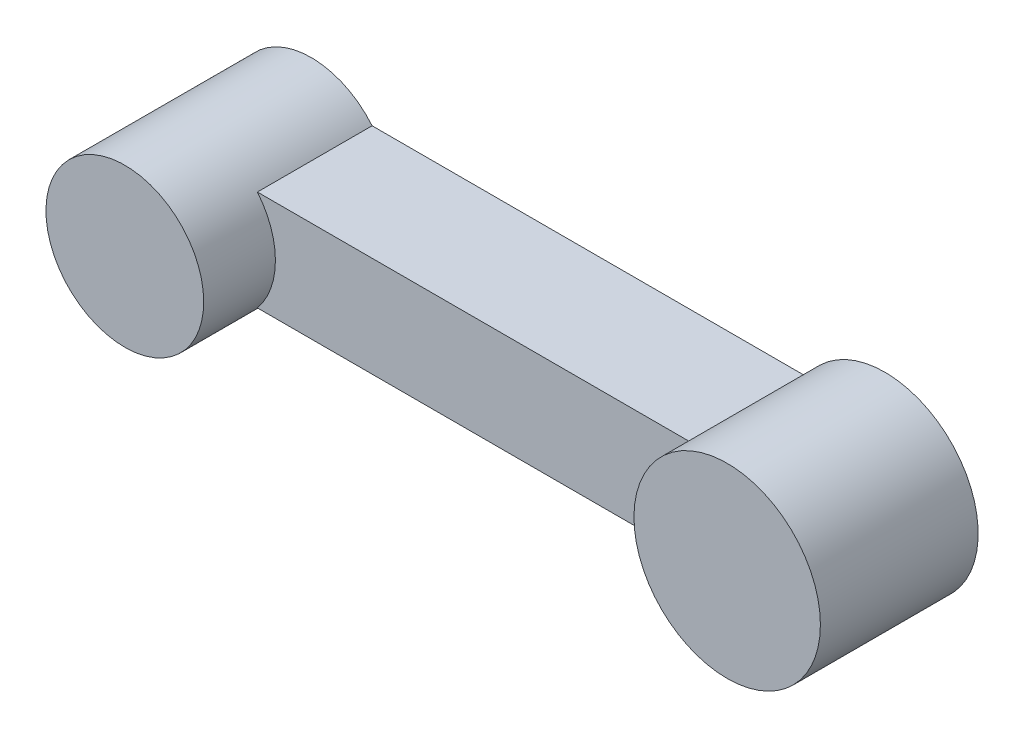
ISO-10303-21;
HEADER;
FILE_DESCRIPTION(('STEP AP214'),'2;1');
FILE_NAME('part.step','',(''),(''),'','','');
FILE_SCHEMA(('AUTOMOTIVE_DESIGN { 1 0 10303 214 1 1 1 1 }'));
ENDSEC;
DATA;
#1=APPLICATION_CONTEXT('core data for automotive mechanical design processes');
#2=APPLICATION_PROTOCOL_DEFINITION('international standard','automotive_design',2000,#1);
#3=PRODUCT_CONTEXT('',#1,'mechanical');
#4=PRODUCT('Part','Part','',(#3));
#5=PRODUCT_RELATED_PRODUCT_CATEGORY('part','',(#4));
#6=PRODUCT_DEFINITION_FORMATION('','',#4);
#7=PRODUCT_DEFINITION_CONTEXT('part definition',#1,'design');
#8=PRODUCT_DEFINITION('design','',#6,#7);
#9=PRODUCT_DEFINITION_SHAPE('','',#8);
#10=(LENGTH_UNIT() NAMED_UNIT(*) SI_UNIT(.MILLI.,.METRE.));
#11=(NAMED_UNIT(*) PLANE_ANGLE_UNIT() SI_UNIT($,.RADIAN.));
#12=(NAMED_UNIT(*) SI_UNIT($,.STERADIAN.) SOLID_ANGLE_UNIT());
#13=UNCERTAINTY_MEASURE_WITH_UNIT(LENGTH_MEASURE(1.E-05),#10,'distance_accuracy_value','');
#14=(GEOMETRIC_REPRESENTATION_CONTEXT(3) GLOBAL_UNCERTAINTY_ASSIGNED_CONTEXT((#13)) GLOBAL_UNIT_ASSIGNED_CONTEXT((#10,
#11,#12)) REPRESENTATION_CONTEXT('',''));
#15=CARTESIAN_POINT('',(0.,0.,0.));
#16=DIRECTION('',(0.,0.,1.));
#17=DIRECTION('',(1.,0.,0.));
#18=AXIS2_PLACEMENT_3D('',#15,#16,#17);
#19=CARTESIAN_POINT('',(20.,5.,16.));
#20=DIRECTION('',(0.,1.,0.));
#21=DIRECTION('',(0.,0.,1.));
#22=AXIS2_PLACEMENT_3D('',#19,#20,#21);
#23=PLANE('',#22);
#24=DIRECTION('',(0.,0.,-1.));
#25=VECTOR('',#24,1.);
#26=CARTESIAN_POINT('',(89.0455488498967,5.,22.));
#27=LINE('',#26,#25);
#28=CARTESIAN_POINT('',(89.0455488498967,5.,16.));
#29=VERTEX_POINT('',#28);
#30=CARTESIAN_POINT('',(89.0455488498967,5.,0.));
#31=VERTEX_POINT('',#30);
#32=EDGE_CURVE('E84',#29,#31,#27,.T.);
#33=ORIENTED_EDGE('',*,*,#32,.F.);
#34=DIRECTION('',(1.,0.,0.));
#35=VECTOR('',#34,1.);
#36=CARTESIAN_POINT('',(20.,5.,16.));
#37=LINE('',#36,#35);
#38=CARTESIAN_POINT('',(28.4852813742386,5.,16.));
#39=VERTEX_POINT('',#38);
#40=EDGE_CURVE('E49',#39,#29,#37,.T.);
#41=ORIENTED_EDGE('',*,*,#40,.F.);
#42=DIRECTION('',(0.,0.,-1.));
#43=VECTOR('',#42,1.);
#44=CARTESIAN_POINT('',(28.4852813742386,5.,26.));
#45=LINE('',#44,#43);
#46=CARTESIAN_POINT('',(28.4852813742386,5.,0.));
#47=VERTEX_POINT('',#46);
#48=EDGE_CURVE('E65',#47,#39,#45,.F.);
#49=ORIENTED_EDGE('',*,*,#48,.F.);
#50=DIRECTION('',(1.,0.,0.));
#51=VECTOR('',#50,1.);
#52=CARTESIAN_POINT('',(20.,5.,0.));
#53=LINE('',#52,#51);
#54=EDGE_CURVE('E101',#47,#31,#53,.T.);
#55=ORIENTED_EDGE('',*,*,#54,.T.);
#56=EDGE_LOOP('',(#33,#41,#49,#55));
#57=FACE_BOUND('',#56,.T.);
#58=ADVANCED_FACE('F41',(#57),#23,.F.);
#59=CARTESIAN_POINT('',(100.,19.,16.));
#60=DIRECTION('',(0.,-1.,0.));
#61=DIRECTION('',(0.,0.,-1.));
#62=AXIS2_PLACEMENT_3D('',#59,#60,#61);
#63=PLANE('',#62);
#64=DIRECTION('',(0.,0.,-1.));
#65=VECTOR('',#64,1.);
#66=CARTESIAN_POINT('',(89.0455488498967,19.,22.));
#67=LINE('',#66,#65);
#68=CARTESIAN_POINT('',(89.0455488498967,19.,0.));
#69=VERTEX_POINT('',#68);
#70=CARTESIAN_POINT('',(89.0455488498967,19.,16.));
#71=VERTEX_POINT('',#70);
#72=EDGE_CURVE('E57',#69,#71,#67,.F.);
#73=ORIENTED_EDGE('',*,*,#72,.F.);
#74=DIRECTION('',(-1.,0.,0.));
#75=VECTOR('',#74,1.);
#76=CARTESIAN_POINT('',(100.,19.,0.));
#77=LINE('',#76,#75);
#78=CARTESIAN_POINT('',(28.4852813742386,19.,0.));
#79=VERTEX_POINT('',#78);
#80=EDGE_CURVE('E44',#69,#79,#77,.T.);
#81=ORIENTED_EDGE('',*,*,#80,.T.);
#82=DIRECTION('',(0.,0.,-1.));
#83=VECTOR('',#82,1.);
#84=CARTESIAN_POINT('',(28.4852813742386,19.,26.));
#85=LINE('',#84,#83);
#86=CARTESIAN_POINT('',(28.4852813742386,19.,16.));
#87=VERTEX_POINT('',#86);
#88=EDGE_CURVE('E105',#87,#79,#85,.T.);
#89=ORIENTED_EDGE('',*,*,#88,.F.);
#90=DIRECTION('',(-1.,0.,0.));
#91=VECTOR('',#90,1.);
#92=CARTESIAN_POINT('',(100.,19.,16.));
#93=LINE('',#92,#91);
#94=EDGE_CURVE('E11',#71,#87,#93,.T.);
#95=ORIENTED_EDGE('',*,*,#94,.F.);
#96=EDGE_LOOP('',(#73,#81,#89,#95));
#97=FACE_BOUND('',#96,.T.);
#98=ADVANCED_FACE('F93',(#97),#63,.F.);
#99=CARTESIAN_POINT('',(0.,0.,16.));
#100=DIRECTION('',(0.,0.,1.));
#101=DIRECTION('',(1.,0.,0.));
#102=AXIS2_PLACEMENT_3D('',#99,#100,#101);
#103=PLANE('',#102);
#104=ORIENTED_EDGE('',*,*,#40,.T.);
#105=CARTESIAN_POINT('',(100.,12.,16.));
#106=DIRECTION('',(0.,0.,1.));
#107=DIRECTION('',(1.,0.,0.));
#108=AXIS2_PLACEMENT_3D('',#105,#106,#107);
#109=CIRCLE('',#108,13.);
#110=EDGE_CURVE('E96',#29,#71,#109,.F.);
#111=ORIENTED_EDGE('',*,*,#110,.T.);
#112=ORIENTED_EDGE('',*,*,#94,.T.);
#113=CARTESIAN_POINT('',(20.,12.,16.));
#114=DIRECTION('',(0.,0.,1.));
#115=DIRECTION('',(1.,0.,0.));
#116=AXIS2_PLACEMENT_3D('',#113,#114,#115);
#117=CIRCLE('',#116,11.);
#118=EDGE_CURVE('E109',#87,#39,#117,.F.);
#119=ORIENTED_EDGE('',*,*,#118,.T.);
#120=EDGE_LOOP('',(#104,#111,#112,#119));
#121=FACE_BOUND('',#120,.T.);
#122=ADVANCED_FACE('F138',(#121),#103,.T.);
#123=CARTESIAN_POINT('',(0.,0.,0.));
#124=DIRECTION('',(0.,0.,1.));
#125=DIRECTION('',(1.,0.,0.));
#126=AXIS2_PLACEMENT_3D('',#123,#124,#125);
#127=PLANE('',#126);
#128=ORIENTED_EDGE('',*,*,#80,.F.);
#129=CARTESIAN_POINT('',(100.,12.,0.));
#130=DIRECTION('',(0.,0.,1.));
#131=DIRECTION('',(1.,0.,0.));
#132=AXIS2_PLACEMENT_3D('',#129,#130,#131);
#133=CIRCLE('',#132,13.);
#134=EDGE_CURVE('E81',#31,#69,#133,.T.);
#135=ORIENTED_EDGE('',*,*,#134,.F.);
#136=ORIENTED_EDGE('',*,*,#54,.F.);
#137=CARTESIAN_POINT('',(20.,12.,0.));
#138=DIRECTION('',(0.,0.,1.));
#139=DIRECTION('',(1.,0.,0.));
#140=AXIS2_PLACEMENT_3D('',#137,#138,#139);
#141=CIRCLE('',#140,11.);
#142=EDGE_CURVE('E100',#79,#47,#141,.T.);
#143=ORIENTED_EDGE('',*,*,#142,.F.);
#144=EDGE_LOOP('',(#128,#135,#136,#143));
#145=FACE_BOUND('',#144,.T.);
#146=ADVANCED_FACE('F99',(#145),#127,.F.);
#147=CARTESIAN_POINT('',(20.,12.,26.));
#148=DIRECTION('',(0.,0.,-1.));
#149=DIRECTION('',(-1.,0.,0.));
#150=AXIS2_PLACEMENT_3D('',#147,#148,#149);
#151=CYLINDRICAL_SURFACE('',#150,11.);
#152=CARTESIAN_POINT('',(20.,12.,26.));
#153=DIRECTION('',(0.,0.,1.));
#154=DIRECTION('',(1.,0.,0.));
#155=AXIS2_PLACEMENT_3D('',#152,#153,#154);
#156=CIRCLE('',#155,11.);
#157=CARTESIAN_POINT('',(31.,12.,26.));
#158=VERTEX_POINT('',#157);
#159=EDGE_CURVE('E111',#158,#158,#156,.T.);
#160=ORIENTED_EDGE('',*,*,#159,.F.);
#161=EDGE_LOOP('',(#160));
#162=FACE_BOUND('',#161,.T.);
#163=ORIENTED_EDGE('',*,*,#142,.T.);
#164=ORIENTED_EDGE('',*,*,#48,.T.);
#165=ORIENTED_EDGE('',*,*,#118,.F.);
#166=ORIENTED_EDGE('',*,*,#88,.T.);
#167=EDGE_LOOP('',(#163,#164,#165,#166));
#168=FACE_BOUND('',#167,.T.);
#169=ADVANCED_FACE('F131',(#162,#168),#151,.T.);
#170=CARTESIAN_POINT('',(20.,12.,26.));
#171=DIRECTION('',(0.,0.,1.));
#172=DIRECTION('',(1.,0.,0.));
#173=AXIS2_PLACEMENT_3D('',#170,#171,#172);
#174=PLANE('',#173);
#175=ORIENTED_EDGE('',*,*,#159,.T.);
#176=EDGE_LOOP('',(#175));
#177=FACE_BOUND('',#176,.T.);
#178=ADVANCED_FACE('F123',(#177),#174,.T.);
#179=CARTESIAN_POINT('',(100.,12.,22.));
#180=DIRECTION('',(0.,0.,-1.));
#181=DIRECTION('',(-1.,0.,0.));
#182=AXIS2_PLACEMENT_3D('',#179,#180,#181);
#183=CYLINDRICAL_SURFACE('',#182,13.);
#184=CARTESIAN_POINT('',(100.,12.,22.));
#185=DIRECTION('',(0.,0.,1.));
#186=DIRECTION('',(1.,0.,0.));
#187=AXIS2_PLACEMENT_3D('',#184,#185,#186);
#188=CIRCLE('',#187,13.);
#189=CARTESIAN_POINT('',(113.,12.,22.));
#190=VERTEX_POINT('',#189);
#191=EDGE_CURVE('E89',#190,#190,#188,.T.);
#192=ORIENTED_EDGE('',*,*,#191,.F.);
#193=EDGE_LOOP('',(#192));
#194=FACE_BOUND('',#193,.T.);
#195=ORIENTED_EDGE('',*,*,#110,.F.);
#196=ORIENTED_EDGE('',*,*,#32,.T.);
#197=ORIENTED_EDGE('',*,*,#134,.T.);
#198=ORIENTED_EDGE('',*,*,#72,.T.);
#199=EDGE_LOOP('',(#195,#196,#197,#198));
#200=FACE_BOUND('',#199,.T.);
#201=ADVANCED_FACE('F82',(#194,#200),#183,.T.);
#202=CARTESIAN_POINT('',(100.,12.,22.));
#203=DIRECTION('',(0.,0.,1.));
#204=DIRECTION('',(1.,0.,0.));
#205=AXIS2_PLACEMENT_3D('',#202,#203,#204);
#206=PLANE('',#205);
#207=ORIENTED_EDGE('',*,*,#191,.T.);
#208=EDGE_LOOP('',(#207));
#209=FACE_BOUND('',#208,.T.);
#210=ADVANCED_FACE('F120',(#209),#206,.T.);
#211=CLOSED_SHELL('',(#58,#98,#122,#146,#169,#178,#201,#210));
#212=MANIFOLD_SOLID_BREP('B2',#211);
#213=ADVANCED_BREP_SHAPE_REPRESENTATION('',(#18,#212),#14);
#214=SHAPE_DEFINITION_REPRESENTATION(#9,#213);
ENDSEC;
END-ISO-10303-21;
